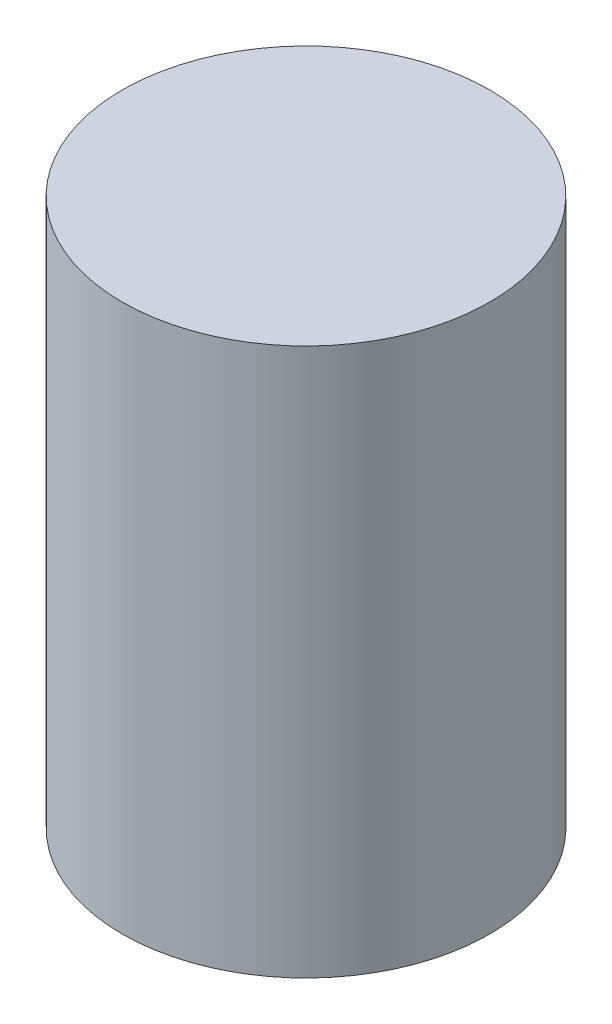
ISO-10303-21;
HEADER;
FILE_DESCRIPTION(('STEP AP214'),'2;1');
FILE_NAME('part.step','',(''),(''),'','','');
FILE_SCHEMA(('AUTOMOTIVE_DESIGN { 1 0 10303 214 1 1 1 1 }'));
ENDSEC;
DATA;
#1=APPLICATION_CONTEXT('core data for automotive mechanical design processes');
#2=APPLICATION_PROTOCOL_DEFINITION('international standard','automotive_design',2000,#1);
#3=PRODUCT_CONTEXT('',#1,'mechanical');
#4=PRODUCT('Part','Part','',(#3));
#5=PRODUCT_RELATED_PRODUCT_CATEGORY('part','',(#4));
#6=PRODUCT_DEFINITION_FORMATION('','',#4);
#7=PRODUCT_DEFINITION_CONTEXT('part definition',#1,'design');
#8=PRODUCT_DEFINITION('design','',#6,#7);
#9=PRODUCT_DEFINITION_SHAPE('','',#8);
#10=(LENGTH_UNIT() NAMED_UNIT(*) SI_UNIT(.MILLI.,.METRE.));
#11=(NAMED_UNIT(*) PLANE_ANGLE_UNIT() SI_UNIT($,.RADIAN.));
#12=(NAMED_UNIT(*) SI_UNIT($,.STERADIAN.) SOLID_ANGLE_UNIT());
#13=UNCERTAINTY_MEASURE_WITH_UNIT(LENGTH_MEASURE(1.E-05),#10,'distance_accuracy_value','');
#14=(GEOMETRIC_REPRESENTATION_CONTEXT(3) GLOBAL_UNCERTAINTY_ASSIGNED_CONTEXT((#13)) GLOBAL_UNIT_ASSIGNED_CONTEXT((#10,
#11,#12)) REPRESENTATION_CONTEXT('',''));
#15=CARTESIAN_POINT('',(0.,0.,0.));
#16=DIRECTION('',(0.,0.,1.));
#17=DIRECTION('',(1.,0.,0.));
#18=AXIS2_PLACEMENT_3D('',#15,#16,#17);
#19=CARTESIAN_POINT('',(0.,7.,0.));
#20=DIRECTION('',(0.,-1.,0.));
#21=DIRECTION('',(0.,0.,-1.));
#22=AXIS2_PLACEMENT_3D('',#19,#20,#21);
#23=CYLINDRICAL_SURFACE('',#22,2.35);
#24=CARTESIAN_POINT('',(0.,7.,0.));
#25=DIRECTION('',(0.,1.,0.));
#26=DIRECTION('',(0.,0.,1.));
#27=AXIS2_PLACEMENT_3D('',#24,#25,#26);
#28=CIRCLE('',#27,2.35);
#29=CARTESIAN_POINT('',(0.,7.,2.35));
#30=VERTEX_POINT('',#29);
#31=EDGE_CURVE('E10',#30,#30,#28,.T.);
#32=ORIENTED_EDGE('',*,*,#31,.F.);
#33=EDGE_LOOP('',(#32));
#34=FACE_BOUND('',#33,.T.);
#35=CARTESIAN_POINT('',(0.,0.,0.));
#36=DIRECTION('',(0.,1.,0.));
#37=DIRECTION('',(0.,0.,1.));
#38=AXIS2_PLACEMENT_3D('',#35,#36,#37);
#39=CIRCLE('',#38,2.35);
#40=CARTESIAN_POINT('',(0.,0.,2.35));
#41=VERTEX_POINT('',#40);
#42=EDGE_CURVE('E36',#41,#41,#39,.T.);
#43=ORIENTED_EDGE('',*,*,#42,.T.);
#44=EDGE_LOOP('',(#43));
#45=FACE_BOUND('',#44,.T.);
#46=ADVANCED_FACE('F33',(#34,#45),#23,.T.);
#47=CARTESIAN_POINT('',(0.,7.,0.));
#48=DIRECTION('',(0.,1.,0.));
#49=DIRECTION('',(0.,0.,1.));
#50=AXIS2_PLACEMENT_3D('',#47,#48,#49);
#51=PLANE('',#50);
#52=ORIENTED_EDGE('',*,*,#31,.T.);
#53=EDGE_LOOP('',(#52));
#54=FACE_BOUND('',#53,.T.);
#55=ADVANCED_FACE('F48',(#54),#51,.T.);
#56=CARTESIAN_POINT('',(0.,0.,0.));
#57=DIRECTION('',(0.,1.,0.));
#58=DIRECTION('',(0.,0.,1.));
#59=AXIS2_PLACEMENT_3D('',#56,#57,#58);
#60=PLANE('',#59);
#61=ORIENTED_EDGE('',*,*,#42,.F.);
#62=EDGE_LOOP('',(#61));
#63=FACE_BOUND('',#62,.T.);
#64=ADVANCED_FACE('F46',(#63),#60,.F.);
#65=CLOSED_SHELL('',(#46,#55,#64));
#66=MANIFOLD_SOLID_BREP('B2',#65);
#67=ADVANCED_BREP_SHAPE_REPRESENTATION('',(#18,#66),#14);
#68=SHAPE_DEFINITION_REPRESENTATION(#9,#67);
ENDSEC;
END-ISO-10303-21;
